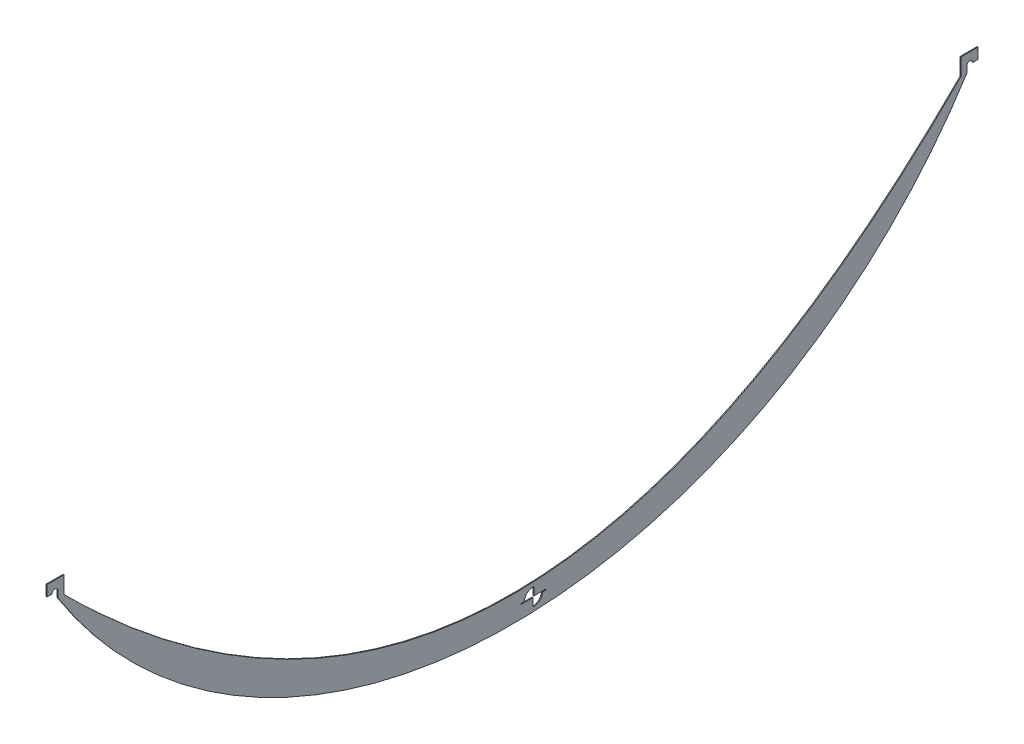
ISO-10303-21;
HEADER;
FILE_DESCRIPTION(('STEP AP214'),'2;1');
FILE_NAME('part.step','',(''),(''),'','','');
FILE_SCHEMA(('AUTOMOTIVE_DESIGN { 1 0 10303 214 1 1 1 1 }'));
ENDSEC;
DATA;
#1=APPLICATION_CONTEXT('core data for automotive mechanical design processes');
#2=APPLICATION_PROTOCOL_DEFINITION('international standard','automotive_design',2000,#1);
#3=PRODUCT_CONTEXT('',#1,'mechanical');
#4=PRODUCT('Part','Part','',(#3));
#5=PRODUCT_RELATED_PRODUCT_CATEGORY('part','',(#4));
#6=PRODUCT_DEFINITION_FORMATION('','',#4);
#7=PRODUCT_DEFINITION_CONTEXT('part definition',#1,'design');
#8=PRODUCT_DEFINITION('design','',#6,#7);
#9=PRODUCT_DEFINITION_SHAPE('','',#8);
#10=(LENGTH_UNIT() NAMED_UNIT(*) SI_UNIT(.MILLI.,.METRE.));
#11=(NAMED_UNIT(*) PLANE_ANGLE_UNIT() SI_UNIT($,.RADIAN.));
#12=(NAMED_UNIT(*) SI_UNIT($,.STERADIAN.) SOLID_ANGLE_UNIT());
#13=UNCERTAINTY_MEASURE_WITH_UNIT(LENGTH_MEASURE(1.E-05),#10,'distance_accuracy_value','');
#14=(GEOMETRIC_REPRESENTATION_CONTEXT(3) GLOBAL_UNCERTAINTY_ASSIGNED_CONTEXT((#13)) GLOBAL_UNIT_ASSIGNED_CONTEXT((#10,
#11,#12)) REPRESENTATION_CONTEXT('',''));
#15=CARTESIAN_POINT('',(0.,0.,0.));
#16=DIRECTION('',(0.,0.,1.));
#17=DIRECTION('',(1.,0.,0.));
#18=AXIS2_PLACEMENT_3D('',#15,#16,#17);
#19=CARTESIAN_POINT('',(2.54,999668.212470862,-51519.8990676631));
#20=CARTESIAN_POINT('',(2.54,-1000331.78752917,-5.61868773729657E-07));
#21=CARTESIAN_POINT('',(2.54,999668.212470804,51519.8990687846));
#22=B_SPLINE_CURVE_WITH_KNOTS('',2,(#19,#20,#21),.UNSPECIFIED.,.F.,.F.,(3,3),(0.,1.),.UNSPECIFIED.);
#23=DIRECTION('',(-1.,0.,0.));
#24=VECTOR('',#23,1.);
#25=SURFACE_OF_LINEAR_EXTRUSION('',#22,#24);
#26=CARTESIAN_POINT('',(0.,999668.212470862,-51519.8990676631));
#27=CARTESIAN_POINT('',(0.,-1000331.78752917,-5.61868773729657E-07));
#28=CARTESIAN_POINT('',(0.,999668.212470804,51519.8990687846));
#29=B_SPLINE_CURVE_WITH_KNOTS('',2,(#26,#27,#28),.UNSPECIFIED.,.F.,.F.,(3,3),(0.,1.),.UNSPECIFIED.);
#30=CARTESIAN_POINT('',(0.,331.787470833103,-1327.15));
#31=VERTEX_POINT('',#30);
#32=CARTESIAN_POINT('',(0.,331.787470833103,1327.15));
#33=VERTEX_POINT('',#32);
#34=EDGE_CURVE('E283',#31,#33,#29,.T.);
#35=ORIENTED_EDGE('',*,*,#34,.T.);
#36=DIRECTION('',(-1.,0.,0.));
#37=VECTOR('',#36,1.);
#38=CARTESIAN_POINT('',(2.54,331.787470833103,1327.15));
#39=LINE('',#38,#37);
#40=CARTESIAN_POINT('',(2.54,331.787470833103,1327.15));
#41=VERTEX_POINT('',#40);
#42=EDGE_CURVE('E11',#41,#33,#39,.T.);
#43=ORIENTED_EDGE('',*,*,#42,.F.);
#44=CARTESIAN_POINT('',(2.54,331.787470833103,-1327.15));
#45=VERTEX_POINT('',#44);
#46=EDGE_CURVE('E302',#45,#41,#22,.T.);
#47=ORIENTED_EDGE('',*,*,#46,.F.);
#48=DIRECTION('',(-1.,0.,0.));
#49=VECTOR('',#48,1.);
#50=CARTESIAN_POINT('',(2.54,331.787470833103,-1327.15));
#51=LINE('',#50,#49);
#52=EDGE_CURVE('E338',#45,#31,#51,.T.);
#53=ORIENTED_EDGE('',*,*,#52,.T.);
#54=EDGE_LOOP('',(#35,#43,#47,#53));
#55=FACE_BOUND('',#54,.T.);
#56=ADVANCED_FACE('F33',(#55),#25,.F.);
#57=CARTESIAN_POINT('',(2.54,331.787470833103,1327.15));
#58=DIRECTION('',(0.,-8.47967620314441E-12,1.));
#59=DIRECTION('',(0.,-1.,-8.47967620314441E-12));
#60=AXIS2_PLACEMENT_3D('',#57,#58,#59);
#61=PLANE('',#60);
#62=DIRECTION('',(0.,1.,8.47967620314441E-12));
#63=VECTOR('',#62,1.);
#64=CARTESIAN_POINT('',(0.,331.787470833103,1327.15));
#65=LINE('',#64,#63);
#66=CARTESIAN_POINT('',(0.,382.587350832628,1327.15000000043));
#67=VERTEX_POINT('',#66);
#68=EDGE_CURVE('E343',#33,#67,#65,.T.);
#69=ORIENTED_EDGE('',*,*,#68,.T.);
#70=DIRECTION('',(-1.,0.,0.));
#71=VECTOR('',#70,1.);
#72=CARTESIAN_POINT('',(2.54,382.587350832628,1327.15000000043));
#73=LINE('',#72,#71);
#74=CARTESIAN_POINT('',(2.54,382.587350832628,1327.15000000043));
#75=VERTEX_POINT('',#74);
#76=EDGE_CURVE('E41',#75,#67,#73,.T.);
#77=ORIENTED_EDGE('',*,*,#76,.F.);
#78=DIRECTION('',(0.,1.,8.47967620314441E-12));
#79=VECTOR('',#78,1.);
#80=CARTESIAN_POINT('',(2.54,331.787470833103,1327.15));
#81=LINE('',#80,#79);
#82=EDGE_CURVE('E308',#41,#75,#81,.T.);
#83=ORIENTED_EDGE('',*,*,#82,.F.);
#84=ORIENTED_EDGE('',*,*,#42,.T.);
#85=EDGE_LOOP('',(#69,#77,#83,#84));
#86=FACE_BOUND('',#85,.T.);
#87=ADVANCED_FACE('F431',(#86),#61,.F.);
#88=CARTESIAN_POINT('',(2.54,382.587350832628,1327.15000000043));
#89=DIRECTION('',(0.,-1.,0.));
#90=DIRECTION('',(0.,0.,-1.));
#91=AXIS2_PLACEMENT_3D('',#88,#89,#90);
#92=PLANE('',#91);
#93=DIRECTION('',(0.,0.,1.));
#94=VECTOR('',#93,1.);
#95=CARTESIAN_POINT('',(0.,382.587350832628,1327.15000000043));
#96=LINE('',#95,#94);
#97=CARTESIAN_POINT('',(0.,382.587350832623,1377.95000240559));
#98=VERTEX_POINT('',#97);
#99=EDGE_CURVE('E348',#67,#98,#96,.T.);
#100=ORIENTED_EDGE('',*,*,#99,.T.);
#101=DIRECTION('',(-1.,0.,0.));
#102=VECTOR('',#101,1.);
#103=CARTESIAN_POINT('',(2.54,382.587350832623,1377.95000240559));
#104=LINE('',#103,#102);
#105=CARTESIAN_POINT('',(2.54,382.587350832623,1377.95000240559));
#106=VERTEX_POINT('',#105);
#107=EDGE_CURVE('E403',#106,#98,#104,.T.);
#108=ORIENTED_EDGE('',*,*,#107,.F.);
#109=DIRECTION('',(0.,0.,1.));
#110=VECTOR('',#109,1.);
#111=CARTESIAN_POINT('',(2.54,382.587350832628,1327.15000000043));
#112=LINE('',#111,#110);
#113=EDGE_CURVE('E314',#75,#106,#112,.T.);
#114=ORIENTED_EDGE('',*,*,#113,.F.);
#115=ORIENTED_EDGE('',*,*,#76,.T.);
#116=EDGE_LOOP('',(#100,#108,#114,#115));
#117=FACE_BOUND('',#116,.T.);
#118=ADVANCED_FACE('F410',(#117),#92,.F.);
#119=CARTESIAN_POINT('',(2.54,382.587350832623,1377.95000240559));
#120=DIRECTION('',(0.,0.,-1.));
#121=DIRECTION('',(0.,1.,0.));
#122=AXIS2_PLACEMENT_3D('',#119,#120,#121);
#123=PLANE('',#122);
#124=DIRECTION('',(0.,-1.,0.));
#125=VECTOR('',#124,1.);
#126=CARTESIAN_POINT('',(0.,382.587350832623,1377.95000240559));
#127=LINE('',#126,#125);
#128=CARTESIAN_POINT('',(0.,350.761150832623,1377.95000240559));
#129=VERTEX_POINT('',#128);
#130=EDGE_CURVE('E350',#98,#129,#127,.T.);
#131=ORIENTED_EDGE('',*,*,#130,.T.);
#132=DIRECTION('',(-1.,0.,0.));
#133=VECTOR('',#132,1.);
#134=CARTESIAN_POINT('',(2.54,350.761150832623,1377.95000240559));
#135=LINE('',#134,#133);
#136=CARTESIAN_POINT('',(2.54,350.761150832623,1377.95000240559));
#137=VERTEX_POINT('',#136);
#138=EDGE_CURVE('E400',#137,#129,#135,.T.);
#139=ORIENTED_EDGE('',*,*,#138,.F.);
#140=DIRECTION('',(0.,-1.,0.));
#141=VECTOR('',#140,1.);
#142=CARTESIAN_POINT('',(2.54,382.587350832623,1377.95000240559));
#143=LINE('',#142,#141);
#144=EDGE_CURVE('E316',#106,#137,#143,.T.);
#145=ORIENTED_EDGE('',*,*,#144,.F.);
#146=ORIENTED_EDGE('',*,*,#107,.T.);
#147=EDGE_LOOP('',(#131,#139,#145,#146));
#148=FACE_BOUND('',#147,.T.);
#149=ADVANCED_FACE('F419',(#148),#123,.F.);
#150=CARTESIAN_POINT('',(2.54,350.761150832623,1377.95000240559));
#151=DIRECTION('',(0.,1.,0.));
#152=DIRECTION('',(0.,0.,1.));
#153=AXIS2_PLACEMENT_3D('',#150,#151,#152);
#154=PLANE('',#153);
#155=DIRECTION('',(0.,0.,-1.));
#156=VECTOR('',#155,1.);
#157=CARTESIAN_POINT('',(0.,350.761150832623,1377.95000240559));
#158=LINE('',#157,#156);
#159=CARTESIAN_POINT('',(0.,350.761150832624,1363.01479812907));
#160=VERTEX_POINT('',#159);
#161=EDGE_CURVE('E352',#129,#160,#158,.T.);
#162=ORIENTED_EDGE('',*,*,#161,.T.);
#163=DIRECTION('',(-1.,0.,0.));
#164=VECTOR('',#163,1.);
#165=CARTESIAN_POINT('',(2.54,350.761150832624,1363.01479812907));
#166=LINE('',#165,#164);
#167=CARTESIAN_POINT('',(2.54,350.761150832624,1363.01479812907));
#168=VERTEX_POINT('',#167);
#169=EDGE_CURVE('E397',#168,#160,#166,.T.);
#170=ORIENTED_EDGE('',*,*,#169,.F.);
#171=DIRECTION('',(0.,0.,-1.));
#172=VECTOR('',#171,1.);
#173=CARTESIAN_POINT('',(2.54,350.761150832623,1377.95000240559));
#174=LINE('',#173,#172);
#175=EDGE_CURVE('E318',#137,#168,#174,.T.);
#176=ORIENTED_EDGE('',*,*,#175,.F.);
#177=ORIENTED_EDGE('',*,*,#138,.T.);
#178=EDGE_LOOP('',(#162,#170,#176,#177));
#179=FACE_BOUND('',#178,.T.);
#180=ADVANCED_FACE('F423',(#179),#154,.F.);
#181=CARTESIAN_POINT('',(2.54,350.761150832626,1354.04859906458));
#182=DIRECTION('',(-1.,0.,0.));
#183=DIRECTION('',(0.,0.,1.));
#184=AXIS2_PLACEMENT_3D('',#181,#182,#183);
#185=CYLINDRICAL_SURFACE('',#184,8.96619906449059);
#186=CARTESIAN_POINT('',(0.,350.761150832626,1354.04859906458));
#187=DIRECTION('',(-1.,0.,0.));
#188=DIRECTION('',(0.,0.,1.));
#189=AXIS2_PLACEMENT_3D('',#186,#187,#188);
#190=CIRCLE('',#189,8.96619906449059);
#191=CARTESIAN_POINT('',(0.,350.761150832626,1345.08240000009));
#192=VERTEX_POINT('',#191);
#193=EDGE_CURVE('E354',#160,#192,#190,.T.);
#194=ORIENTED_EDGE('',*,*,#193,.T.);
#195=DIRECTION('',(-1.,0.,0.));
#196=VECTOR('',#195,1.);
#197=CARTESIAN_POINT('',(2.54,350.761150832626,1345.08240000009));
#198=LINE('',#197,#196);
#199=CARTESIAN_POINT('',(2.54,350.761150832626,1345.08240000009));
#200=VERTEX_POINT('',#199);
#201=EDGE_CURVE('E394',#200,#192,#198,.T.);
#202=ORIENTED_EDGE('',*,*,#201,.F.);
#203=CARTESIAN_POINT('',(2.54,350.761150832626,1354.04859906458));
#204=DIRECTION('',(-1.,0.,0.));
#205=DIRECTION('',(0.,0.,1.));
#206=AXIS2_PLACEMENT_3D('',#203,#204,#205);
#207=CIRCLE('',#206,8.96619906449059);
#208=EDGE_CURVE('E320',#168,#200,#207,.T.);
#209=ORIENTED_EDGE('',*,*,#208,.F.);
#210=ORIENTED_EDGE('',*,*,#169,.T.);
#211=EDGE_LOOP('',(#194,#202,#209,#210));
#212=FACE_BOUND('',#211,.T.);
#213=ADVANCED_FACE('F474',(#212),#185,.F.);
#214=CARTESIAN_POINT('',(2.54,350.761150832626,1345.08240000009));
#215=DIRECTION('',(0.,0.,-1.));
#216=DIRECTION('',(0.,1.,0.));
#217=AXIS2_PLACEMENT_3D('',#214,#215,#216);
#218=PLANE('',#217);
#219=DIRECTION('',(0.,-1.,0.));
#220=VECTOR('',#219,1.);
#221=CARTESIAN_POINT('',(0.,350.761150832626,1345.08240000009));
#222=LINE('',#221,#220);
#223=CARTESIAN_POINT('',(0.,331.787470831942,1345.08240000019));
#224=VERTEX_POINT('',#223);
#225=EDGE_CURVE('E356',#192,#224,#222,.T.);
#226=ORIENTED_EDGE('',*,*,#225,.T.);
#227=DIRECTION('',(-1.,0.,0.));
#228=VECTOR('',#227,1.);
#229=CARTESIAN_POINT('',(2.54,331.787470831942,1345.08240000019));
#230=LINE('',#229,#228);
#231=CARTESIAN_POINT('',(2.54,331.787470831942,1345.08240000019));
#232=VERTEX_POINT('',#231);
#233=EDGE_CURVE('E391',#232,#224,#230,.T.);
#234=ORIENTED_EDGE('',*,*,#233,.F.);
#235=DIRECTION('',(0.,-1.,0.));
#236=VECTOR('',#235,1.);
#237=CARTESIAN_POINT('',(2.54,350.761150832626,1345.08240000009));
#238=LINE('',#237,#236);
#239=EDGE_CURVE('E322',#200,#232,#238,.T.);
#240=ORIENTED_EDGE('',*,*,#239,.F.);
#241=ORIENTED_EDGE('',*,*,#201,.T.);
#242=EDGE_LOOP('',(#226,#234,#240,#241));
#243=FACE_BOUND('',#242,.T.);
#244=ADVANCED_FACE('F472',(#243),#218,.F.);
#245=CARTESIAN_POINT('',(2.54,1184.80616217627,5.1695026170626E-10));
#246=DIRECTION('',(-1.,0.,0.));
#247=DIRECTION('',(0.,0.,1.));
#248=AXIS2_PLACEMENT_3D('',#245,#246,#247);
#249=CYLINDRICAL_SURFACE('',#248,1592.7609835037);
#250=CARTESIAN_POINT('',(0.,1184.80616217627,5.1695026170626E-10));
#251=DIRECTION('',(1.,0.,0.));
#252=DIRECTION('',(0.,0.,1.));
#253=AXIS2_PLACEMENT_3D('',#250,#251,#252);
#254=CIRCLE('',#253,1592.7609835037);
#255=CARTESIAN_POINT('',(0.,331.787470833133,-1345.08240000004));
#256=VERTEX_POINT('',#255);
#257=EDGE_CURVE('E358',#224,#256,#254,.T.);
#258=ORIENTED_EDGE('',*,*,#257,.T.);
#259=DIRECTION('',(-1.,0.,0.));
#260=VECTOR('',#259,1.);
#261=CARTESIAN_POINT('',(2.54,331.787470833133,-1345.08240000004));
#262=LINE('',#261,#260);
#263=CARTESIAN_POINT('',(2.54,331.787470833133,-1345.08240000004));
#264=VERTEX_POINT('',#263);
#265=EDGE_CURVE('E388',#264,#256,#262,.T.);
#266=ORIENTED_EDGE('',*,*,#265,.F.);
#267=CARTESIAN_POINT('',(2.54,1184.80616217627,5.1695026170626E-10));
#268=DIRECTION('',(1.,0.,0.));
#269=DIRECTION('',(0.,0.,1.));
#270=AXIS2_PLACEMENT_3D('',#267,#268,#269);
#271=CIRCLE('',#270,1592.7609835037);
#272=EDGE_CURVE('E324',#232,#264,#271,.T.);
#273=ORIENTED_EDGE('',*,*,#272,.F.);
#274=ORIENTED_EDGE('',*,*,#233,.T.);
#275=EDGE_LOOP('',(#258,#266,#273,#274));
#276=FACE_BOUND('',#275,.T.);
#277=ADVANCED_FACE('F467',(#276),#249,.T.);
#278=CARTESIAN_POINT('',(2.54,350.761150832627,-1345.08240000004));
#279=DIRECTION('',(0.,0.,1.));
#280=DIRECTION('',(1.,0.,0.));
#281=AXIS2_PLACEMENT_3D('',#278,#279,#280);
#282=PLANE('',#281);
#283=DIRECTION('',(0.,1.,0.));
#284=VECTOR('',#283,1.);
#285=CARTESIAN_POINT('',(0.,350.761150832627,-1345.08240000004));
#286=LINE('',#285,#284);
#287=CARTESIAN_POINT('',(0.,350.761150832627,-1345.08240000004));
#288=VERTEX_POINT('',#287);
#289=EDGE_CURVE('E360',#256,#288,#286,.T.);
#290=ORIENTED_EDGE('',*,*,#289,.T.);
#291=DIRECTION('',(-1.,0.,0.));
#292=VECTOR('',#291,1.);
#293=CARTESIAN_POINT('',(2.54,350.761150832627,-1345.08240000004));
#294=LINE('',#293,#292);
#295=CARTESIAN_POINT('',(2.54,350.761150832627,-1345.08240000004));
#296=VERTEX_POINT('',#295);
#297=EDGE_CURVE('E385',#296,#288,#294,.T.);
#298=ORIENTED_EDGE('',*,*,#297,.F.);
#299=DIRECTION('',(0.,1.,0.));
#300=VECTOR('',#299,1.);
#301=CARTESIAN_POINT('',(2.54,350.761150832627,-1345.08240000004));
#302=LINE('',#301,#300);
#303=EDGE_CURVE('E326',#264,#296,#302,.T.);
#304=ORIENTED_EDGE('',*,*,#303,.F.);
#305=ORIENTED_EDGE('',*,*,#265,.T.);
#306=EDGE_LOOP('',(#290,#298,#304,#305));
#307=FACE_BOUND('',#306,.T.);
#308=ADVANCED_FACE('F462',(#307),#282,.F.);
#309=CARTESIAN_POINT('',(2.54,350.761150832627,-1354.04859906454));
#310=DIRECTION('',(-1.,0.,0.));
#311=DIRECTION('',(0.,0.,1.));
#312=AXIS2_PLACEMENT_3D('',#309,#310,#311);
#313=CYLINDRICAL_SURFACE('',#312,8.96619906449081);
#314=CARTESIAN_POINT('',(0.,350.761150832627,-1354.04859906454));
#315=DIRECTION('',(-1.,0.,0.));
#316=DIRECTION('',(0.,0.,-1.));
#317=AXIS2_PLACEMENT_3D('',#314,#315,#316);
#318=CIRCLE('',#317,8.96619906449081);
#319=CARTESIAN_POINT('',(0.,350.761150832627,-1363.01479812903));
#320=VERTEX_POINT('',#319);
#321=EDGE_CURVE('E362',#288,#320,#318,.T.);
#322=ORIENTED_EDGE('',*,*,#321,.T.);
#323=DIRECTION('',(-1.,0.,0.));
#324=VECTOR('',#323,1.);
#325=CARTESIAN_POINT('',(2.54,350.761150832627,-1363.01479812903));
#326=LINE('',#325,#324);
#327=CARTESIAN_POINT('',(2.54,350.761150832627,-1363.01479812903));
#328=VERTEX_POINT('',#327);
#329=EDGE_CURVE('E382',#328,#320,#326,.T.);
#330=ORIENTED_EDGE('',*,*,#329,.F.);
#331=CARTESIAN_POINT('',(2.54,350.761150832627,-1354.04859906454));
#332=DIRECTION('',(-1.,0.,0.));
#333=DIRECTION('',(0.,0.,-1.));
#334=AXIS2_PLACEMENT_3D('',#331,#332,#333);
#335=CIRCLE('',#334,8.96619906449081);
#336=EDGE_CURVE('E328',#296,#328,#335,.T.);
#337=ORIENTED_EDGE('',*,*,#336,.F.);
#338=ORIENTED_EDGE('',*,*,#297,.T.);
#339=EDGE_LOOP('',(#322,#330,#337,#338));
#340=FACE_BOUND('',#339,.T.);
#341=ADVANCED_FACE('F458',(#340),#313,.F.);
#342=CARTESIAN_POINT('',(2.54,350.761150832627,-1377.95000240555));
#343=DIRECTION('',(0.,1.,0.));
#344=DIRECTION('',(0.,0.,1.));
#345=AXIS2_PLACEMENT_3D('',#342,#343,#344);
#346=PLANE('',#345);
#347=DIRECTION('',(0.,0.,-1.));
#348=VECTOR('',#347,1.);
#349=CARTESIAN_POINT('',(0.,350.761150832627,-1377.95000240555));
#350=LINE('',#349,#348);
#351=CARTESIAN_POINT('',(0.,350.761150832627,-1377.95000240555));
#352=VERTEX_POINT('',#351);
#353=EDGE_CURVE('E364',#320,#352,#350,.T.);
#354=ORIENTED_EDGE('',*,*,#353,.T.);
#355=DIRECTION('',(-1.,0.,0.));
#356=VECTOR('',#355,1.);
#357=CARTESIAN_POINT('',(2.54,350.761150832627,-1377.95000240555));
#358=LINE('',#357,#356);
#359=CARTESIAN_POINT('',(2.54,350.761150832627,-1377.95000240555));
#360=VERTEX_POINT('',#359);
#361=EDGE_CURVE('E379',#360,#352,#358,.T.);
#362=ORIENTED_EDGE('',*,*,#361,.F.);
#363=DIRECTION('',(0.,0.,-1.));
#364=VECTOR('',#363,1.);
#365=CARTESIAN_POINT('',(2.54,350.761150832627,-1377.95000240555));
#366=LINE('',#365,#364);
#367=EDGE_CURVE('E330',#328,#360,#366,.T.);
#368=ORIENTED_EDGE('',*,*,#367,.F.);
#369=ORIENTED_EDGE('',*,*,#329,.T.);
#370=EDGE_LOOP('',(#354,#362,#368,#369));
#371=FACE_BOUND('',#370,.T.);
#372=ADVANCED_FACE('F453',(#371),#346,.F.);
#373=CARTESIAN_POINT('',(2.54,382.587350832626,-1377.95000240555));
#374=DIRECTION('',(0.,0.,1.));
#375=DIRECTION('',(1.,0.,0.));
#376=AXIS2_PLACEMENT_3D('',#373,#374,#375);
#377=PLANE('',#376);
#378=DIRECTION('',(0.,1.,0.));
#379=VECTOR('',#378,1.);
#380=CARTESIAN_POINT('',(0.,382.587350832626,-1377.95000240555));
#381=LINE('',#380,#379);
#382=CARTESIAN_POINT('',(0.,382.587350832626,-1377.95000240555));
#383=VERTEX_POINT('',#382);
#384=EDGE_CURVE('E366',#352,#383,#381,.T.);
#385=ORIENTED_EDGE('',*,*,#384,.T.);
#386=DIRECTION('',(-1.,0.,0.));
#387=VECTOR('',#386,1.);
#388=CARTESIAN_POINT('',(2.54,382.587350832626,-1377.95000240555));
#389=LINE('',#388,#387);
#390=CARTESIAN_POINT('',(2.54,382.587350832626,-1377.95000240555));
#391=VERTEX_POINT('',#390);
#392=EDGE_CURVE('E376',#391,#383,#389,.T.);
#393=ORIENTED_EDGE('',*,*,#392,.F.);
#394=DIRECTION('',(0.,1.,0.));
#395=VECTOR('',#394,1.);
#396=CARTESIAN_POINT('',(2.54,382.587350832626,-1377.95000240555));
#397=LINE('',#396,#395);
#398=EDGE_CURVE('E332',#360,#391,#397,.T.);
#399=ORIENTED_EDGE('',*,*,#398,.F.);
#400=ORIENTED_EDGE('',*,*,#361,.T.);
#401=EDGE_LOOP('',(#385,#393,#399,#400));
#402=FACE_BOUND('',#401,.T.);
#403=ADVANCED_FACE('F447',(#402),#377,.F.);
#404=CARTESIAN_POINT('',(2.54,382.587350832626,-1327.14999999998));
#405=DIRECTION('',(0.,-1.,0.));
#406=DIRECTION('',(0.,0.,-1.));
#407=AXIS2_PLACEMENT_3D('',#404,#405,#406);
#408=PLANE('',#407);
#409=DIRECTION('',(0.,0.,1.));
#410=VECTOR('',#409,1.);
#411=CARTESIAN_POINT('',(0.,382.587350832626,-1327.14999999998));
#412=LINE('',#411,#410);
#413=CARTESIAN_POINT('',(0.,382.587350832626,-1327.14999999998));
#414=VERTEX_POINT('',#413);
#415=EDGE_CURVE('E368',#383,#414,#412,.T.);
#416=ORIENTED_EDGE('',*,*,#415,.T.);
#417=DIRECTION('',(-1.,0.,0.));
#418=VECTOR('',#417,1.);
#419=CARTESIAN_POINT('',(2.54,382.587350832626,-1327.14999999998));
#420=LINE('',#419,#418);
#421=CARTESIAN_POINT('',(2.54,382.587350832626,-1327.14999999998));
#422=VERTEX_POINT('',#421);
#423=EDGE_CURVE('E373',#422,#414,#420,.T.);
#424=ORIENTED_EDGE('',*,*,#423,.F.);
#425=DIRECTION('',(0.,0.,1.));
#426=VECTOR('',#425,1.);
#427=CARTESIAN_POINT('',(2.54,382.587350832626,-1327.14999999998));
#428=LINE('',#427,#426);
#429=EDGE_CURVE('E334',#391,#422,#428,.T.);
#430=ORIENTED_EDGE('',*,*,#429,.F.);
#431=ORIENTED_EDGE('',*,*,#392,.T.);
#432=EDGE_LOOP('',(#416,#424,#430,#431));
#433=FACE_BOUND('',#432,.T.);
#434=ADVANCED_FACE('F443',(#433),#408,.F.);
#435=CARTESIAN_POINT('',(2.54,331.787470833103,-1327.15));
#436=DIRECTION('',(0.,4.10870908812159E-13,-1.));
#437=DIRECTION('',(0.,1.,4.10870908812159E-13));
#438=AXIS2_PLACEMENT_3D('',#435,#436,#437);
#439=PLANE('',#438);
#440=DIRECTION('',(0.,-1.,-4.10870908812159E-13));
#441=VECTOR('',#440,1.);
#442=CARTESIAN_POINT('',(0.,331.787470833103,-1327.15));
#443=LINE('',#442,#441);
#444=EDGE_CURVE('E309',#414,#31,#443,.T.);
#445=ORIENTED_EDGE('',*,*,#444,.T.);
#446=ORIENTED_EDGE('',*,*,#52,.F.);
#447=DIRECTION('',(0.,-1.,-4.10870908812159E-13));
#448=VECTOR('',#447,1.);
#449=CARTESIAN_POINT('',(2.54,331.787470833103,-1327.15));
#450=LINE('',#449,#448);
#451=EDGE_CURVE('E336',#422,#45,#450,.T.);
#452=ORIENTED_EDGE('',*,*,#451,.F.);
#453=ORIENTED_EDGE('',*,*,#423,.T.);
#454=EDGE_LOOP('',(#445,#446,#452,#453));
#455=FACE_BOUND('',#454,.T.);
#456=ADVANCED_FACE('F438',(#455),#439,.F.);
#457=CARTESIAN_POINT('',(2.54,-331.787529166974,-5.61328761250479E-10));
#458=DIRECTION('',(1.,0.,0.));
#459=DIRECTION('',(0.,0.,-1.));
#460=AXIS2_PLACEMENT_3D('',#457,#458,#459);
#461=PLANE('',#460);
#462=DIRECTION('',(0.,0.,1.));
#463=VECTOR('',#462,1.);
#464=CARTESIAN_POINT('',(2.54,-367.132479543067,-35.3401144828838));
#465=LINE('',#464,#463);
#466=CARTESIAN_POINT('',(2.54,-367.132479543067,-35.3401144828838));
#467=VERTEX_POINT('',#466);
#468=CARTESIAN_POINT('',(2.54,-367.132479543067,-25.1801144828838));
#469=VERTEX_POINT('',#468);
#470=EDGE_CURVE('E48',#467,#469,#465,.T.);
#471=ORIENTED_EDGE('',*,*,#470,.F.);
#472=CARTESIAN_POINT('',(2.54,-368.402459675709,-60.7083456088944));
#473=DIRECTION('',(1.,0.,0.));
#474=DIRECTION('',(0.,0.,-1.));
#475=AXIS2_PLACEMENT_3D('',#472,#473,#474);
#476=CIRCLE('',#475,25.4);
#477=CARTESIAN_POINT('',(2.54,-343.002479543067,-60.7401144828838));
#478=VERTEX_POINT('',#477);
#479=EDGE_CURVE('E224',#478,#467,#476,.T.);
#480=ORIENTED_EDGE('',*,*,#479,.F.);
#481=DIRECTION('',(0.,0.,-1.));
#482=VECTOR('',#481,1.);
#483=CARTESIAN_POINT('',(2.54,-343.002479543067,-60.7401144828838));
#484=LINE('',#483,#482);
#485=CARTESIAN_POINT('',(2.54,-343.002479543067,-63.2801144828838));
#486=VERTEX_POINT('',#485);
#487=EDGE_CURVE('E227',#478,#486,#484,.T.);
#488=ORIENTED_EDGE('',*,*,#487,.T.);
#489=DIRECTION('',(0.,-1.,0.));
#490=VECTOR('',#489,1.);
#491=CARTESIAN_POINT('',(2.54,-343.002479543067,-63.2801144828838));
#492=LINE('',#491,#490);
#493=CARTESIAN_POINT('',(2.54,-367.132479543067,-63.2801144828838));
#494=VERTEX_POINT('',#493);
#495=EDGE_CURVE('E276',#486,#494,#492,.T.);
#496=ORIENTED_EDGE('',*,*,#495,.T.);
#497=DIRECTION('',(0.,0.,1.));
#498=VECTOR('',#497,1.);
#499=CARTESIAN_POINT('',(2.54,-367.132479543067,-98.8401144828838));
#500=LINE('',#499,#498);
#501=CARTESIAN_POINT('',(2.54,-367.132479543067,-98.8401144828838));
#502=VERTEX_POINT('',#501);
#503=EDGE_CURVE('E273',#502,#494,#500,.T.);
#504=ORIENTED_EDGE('',*,*,#503,.F.);
#505=DIRECTION('',(0.,1.,0.));
#506=VECTOR('',#505,1.);
#507=CARTESIAN_POINT('',(2.54,-369.672479543067,-98.8401144828838));
#508=LINE('',#507,#506);
#509=CARTESIAN_POINT('',(2.54,-369.672479543067,-98.8401144828838));
#510=VERTEX_POINT('',#509);
#511=EDGE_CURVE('E270',#510,#502,#508,.T.);
#512=ORIENTED_EDGE('',*,*,#511,.F.);
#513=DIRECTION('',(0.,0.,-1.));
#514=VECTOR('',#513,1.);
#515=CARTESIAN_POINT('',(2.54,-369.672479543067,-88.6801144828838));
#516=LINE('',#515,#514);
#517=CARTESIAN_POINT('',(2.54,-369.672479543067,-88.6801144828839));
#518=VERTEX_POINT('',#517);
#519=EDGE_CURVE('E267',#518,#510,#516,.T.);
#520=ORIENTED_EDGE('',*,*,#519,.F.);
#521=CARTESIAN_POINT('',(2.54,-368.402499410424,-63.3118833568732));
#522=DIRECTION('',(1.,0.,0.));
#523=DIRECTION('',(0.,0.,-1.));
#524=AXIS2_PLACEMENT_3D('',#521,#522,#523);
#525=CIRCLE('',#524,25.4);
#526=CARTESIAN_POINT('',(2.54,-393.802479543067,-63.2801144828838));
#527=VERTEX_POINT('',#526);
#528=EDGE_CURVE('E264',#527,#518,#525,.T.);
#529=ORIENTED_EDGE('',*,*,#528,.F.);
#530=DIRECTION('',(0.,0.,1.));
#531=VECTOR('',#530,1.);
#532=CARTESIAN_POINT('',(2.54,-393.802479543067,-63.2801144828838));
#533=LINE('',#532,#531);
#534=CARTESIAN_POINT('',(2.54,-393.802479543067,-60.7401144828838));
#535=VERTEX_POINT('',#534);
#536=EDGE_CURVE('E261',#527,#535,#533,.T.);
#537=ORIENTED_EDGE('',*,*,#536,.T.);
#538=DIRECTION('',(0.,1.,0.));
#539=VECTOR('',#538,1.);
#540=CARTESIAN_POINT('',(2.54,-393.802479543067,-60.7401144828838));
#541=LINE('',#540,#539);
#542=CARTESIAN_POINT('',(2.54,-369.672479543067,-60.7401144828838));
#543=VERTEX_POINT('',#542);
#544=EDGE_CURVE('E258',#535,#543,#541,.T.);
#545=ORIENTED_EDGE('',*,*,#544,.T.);
#546=DIRECTION('',(0.,0.,1.));
#547=VECTOR('',#546,1.);
#548=CARTESIAN_POINT('',(2.54,-369.672479543067,-60.7401144828838));
#549=LINE('',#548,#547);
#550=CARTESIAN_POINT('',(2.54,-369.672479543067,-25.1801144828838));
#551=VERTEX_POINT('',#550);
#552=EDGE_CURVE('E255',#543,#551,#549,.T.);
#553=ORIENTED_EDGE('',*,*,#552,.T.);
#554=DIRECTION('',(0.,-1.,0.));
#555=VECTOR('',#554,1.);
#556=CARTESIAN_POINT('',(2.54,-367.132479543067,-25.1801144828838));
#557=LINE('',#556,#555);
#558=EDGE_CURVE('E253',#469,#551,#557,.T.);
#559=ORIENTED_EDGE('',*,*,#558,.F.);
#560=EDGE_LOOP('',(#471,#480,#488,#496,#504,#512,#520,#529,#537,#545,#553,#559));
#561=FACE_BOUND('',#560,.T.);
#562=ORIENTED_EDGE('',*,*,#46,.T.);
#563=ORIENTED_EDGE('',*,*,#82,.T.);
#564=ORIENTED_EDGE('',*,*,#113,.T.);
#565=ORIENTED_EDGE('',*,*,#144,.T.);
#566=ORIENTED_EDGE('',*,*,#175,.T.);
#567=ORIENTED_EDGE('',*,*,#208,.T.);
#568=ORIENTED_EDGE('',*,*,#239,.T.);
#569=ORIENTED_EDGE('',*,*,#272,.T.);
#570=ORIENTED_EDGE('',*,*,#303,.T.);
#571=ORIENTED_EDGE('',*,*,#336,.T.);
#572=ORIENTED_EDGE('',*,*,#367,.T.);
#573=ORIENTED_EDGE('',*,*,#398,.T.);
#574=ORIENTED_EDGE('',*,*,#429,.T.);
#575=ORIENTED_EDGE('',*,*,#451,.T.);
#576=EDGE_LOOP('',(#562,#563,#564,#565,#566,#567,#568,#569,#570,#571,#572,#573,#574,#575));
#577=FACE_BOUND('',#576,.T.);
#578=ADVANCED_FACE('F427',(#561,#577),#461,.T.);
#579=CARTESIAN_POINT('',(0.,-331.787529166974,-5.61328761250479E-10));
#580=DIRECTION('',(1.,0.,0.));
#581=DIRECTION('',(0.,0.,-1.));
#582=AXIS2_PLACEMENT_3D('',#579,#580,#581);
#583=PLANE('',#582);
#584=CARTESIAN_POINT('',(0.,-368.402459675709,-60.7083456088944));
#585=DIRECTION('',(1.,0.,0.));
#586=DIRECTION('',(0.,0.,-1.));
#587=AXIS2_PLACEMENT_3D('',#584,#585,#586);
#588=CIRCLE('',#587,25.4);
#589=CARTESIAN_POINT('',(0.,-343.002479543067,-60.7401144828838));
#590=VERTEX_POINT('',#589);
#591=CARTESIAN_POINT('',(0.,-367.132479543067,-35.3401144828838));
#592=VERTEX_POINT('',#591);
#593=EDGE_CURVE('E211',#590,#592,#588,.T.);
#594=ORIENTED_EDGE('',*,*,#593,.T.);
#595=DIRECTION('',(0.,0.,1.));
#596=VECTOR('',#595,1.);
#597=CARTESIAN_POINT('',(0.,-367.132479543067,-35.3401144828838));
#598=LINE('',#597,#596);
#599=CARTESIAN_POINT('',(0.,-367.132479543067,-25.1801144828838));
#600=VERTEX_POINT('',#599);
#601=EDGE_CURVE('E208',#592,#600,#598,.T.);
#602=ORIENTED_EDGE('',*,*,#601,.T.);
#603=DIRECTION('',(0.,-1.,0.));
#604=VECTOR('',#603,1.);
#605=CARTESIAN_POINT('',(0.,-367.132479543067,-25.1801144828838));
#606=LINE('',#605,#604);
#607=CARTESIAN_POINT('',(0.,-369.672479543067,-25.1801144828838));
#608=VERTEX_POINT('',#607);
#609=EDGE_CURVE('E214',#600,#608,#606,.T.);
#610=ORIENTED_EDGE('',*,*,#609,.T.);
#611=DIRECTION('',(0.,0.,1.));
#612=VECTOR('',#611,1.);
#613=CARTESIAN_POINT('',(0.,-369.672479543067,-60.7401144828838));
#614=LINE('',#613,#612);
#615=CARTESIAN_POINT('',(0.,-369.672479543067,-60.7401144828838));
#616=VERTEX_POINT('',#615);
#617=EDGE_CURVE('E218',#616,#608,#614,.T.);
#618=ORIENTED_EDGE('',*,*,#617,.F.);
#619=DIRECTION('',(0.,1.,0.));
#620=VECTOR('',#619,1.);
#621=CARTESIAN_POINT('',(0.,-393.802479543067,-60.7401144828838));
#622=LINE('',#621,#620);
#623=CARTESIAN_POINT('',(0.,-393.802479543067,-60.7401144828838));
#624=VERTEX_POINT('',#623);
#625=EDGE_CURVE('E231',#624,#616,#622,.T.);
#626=ORIENTED_EDGE('',*,*,#625,.F.);
#627=DIRECTION('',(0.,0.,1.));
#628=VECTOR('',#627,1.);
#629=CARTESIAN_POINT('',(0.,-393.802479543067,-63.2801144828838));
#630=LINE('',#629,#628);
#631=CARTESIAN_POINT('',(0.,-393.802479543067,-63.2801144828838));
#632=VERTEX_POINT('',#631);
#633=EDGE_CURVE('E233',#632,#624,#630,.T.);
#634=ORIENTED_EDGE('',*,*,#633,.F.);
#635=CARTESIAN_POINT('',(0.,-368.402499410424,-63.3118833568732));
#636=DIRECTION('',(1.,0.,0.));
#637=DIRECTION('',(0.,0.,-1.));
#638=AXIS2_PLACEMENT_3D('',#635,#636,#637);
#639=CIRCLE('',#638,25.4);
#640=CARTESIAN_POINT('',(0.,-369.672479543067,-88.6801144828839));
#641=VERTEX_POINT('',#640);
#642=EDGE_CURVE('E235',#632,#641,#639,.T.);
#643=ORIENTED_EDGE('',*,*,#642,.T.);
#644=DIRECTION('',(0.,0.,-1.));
#645=VECTOR('',#644,1.);
#646=CARTESIAN_POINT('',(0.,-369.672479543067,-88.6801144828838));
#647=LINE('',#646,#645);
#648=CARTESIAN_POINT('',(0.,-369.672479543067,-98.8401144828838));
#649=VERTEX_POINT('',#648);
#650=EDGE_CURVE('E238',#641,#649,#647,.T.);
#651=ORIENTED_EDGE('',*,*,#650,.T.);
#652=DIRECTION('',(0.,1.,0.));
#653=VECTOR('',#652,1.);
#654=CARTESIAN_POINT('',(0.,-369.672479543067,-98.8401144828838));
#655=LINE('',#654,#653);
#656=CARTESIAN_POINT('',(0.,-367.132479543067,-98.8401144828838));
#657=VERTEX_POINT('',#656);
#658=EDGE_CURVE('E241',#649,#657,#655,.T.);
#659=ORIENTED_EDGE('',*,*,#658,.T.);
#660=DIRECTION('',(0.,0.,1.));
#661=VECTOR('',#660,1.);
#662=CARTESIAN_POINT('',(0.,-367.132479543067,-98.8401144828838));
#663=LINE('',#662,#661);
#664=CARTESIAN_POINT('',(0.,-367.132479543067,-63.2801144828838));
#665=VERTEX_POINT('',#664);
#666=EDGE_CURVE('E244',#657,#665,#663,.T.);
#667=ORIENTED_EDGE('',*,*,#666,.T.);
#668=DIRECTION('',(0.,-1.,0.));
#669=VECTOR('',#668,1.);
#670=CARTESIAN_POINT('',(0.,-343.002479543067,-63.2801144828838));
#671=LINE('',#670,#669);
#672=CARTESIAN_POINT('',(0.,-343.002479543067,-63.2801144828838));
#673=VERTEX_POINT('',#672);
#674=EDGE_CURVE('E247',#673,#665,#671,.T.);
#675=ORIENTED_EDGE('',*,*,#674,.F.);
#676=DIRECTION('',(0.,0.,-1.));
#677=VECTOR('',#676,1.);
#678=CARTESIAN_POINT('',(0.,-343.002479543067,-60.7401144828838));
#679=LINE('',#678,#677);
#680=EDGE_CURVE('E249',#590,#673,#679,.T.);
#681=ORIENTED_EDGE('',*,*,#680,.F.);
#682=EDGE_LOOP('',(#594,#602,#610,#618,#626,#634,#643,#651,#659,#667,#675,#681));
#683=FACE_BOUND('',#682,.T.);
#684=ORIENTED_EDGE('',*,*,#34,.F.);
#685=ORIENTED_EDGE('',*,*,#444,.F.);
#686=ORIENTED_EDGE('',*,*,#415,.F.);
#687=ORIENTED_EDGE('',*,*,#384,.F.);
#688=ORIENTED_EDGE('',*,*,#353,.F.);
#689=ORIENTED_EDGE('',*,*,#321,.F.);
#690=ORIENTED_EDGE('',*,*,#289,.F.);
#691=ORIENTED_EDGE('',*,*,#257,.F.);
#692=ORIENTED_EDGE('',*,*,#225,.F.);
#693=ORIENTED_EDGE('',*,*,#193,.F.);
#694=ORIENTED_EDGE('',*,*,#161,.F.);
#695=ORIENTED_EDGE('',*,*,#130,.F.);
#696=ORIENTED_EDGE('',*,*,#99,.F.);
#697=ORIENTED_EDGE('',*,*,#68,.F.);
#698=EDGE_LOOP('',(#684,#685,#686,#687,#688,#689,#690,#691,#692,#693,#694,#695,#696,#697));
#699=FACE_BOUND('',#698,.T.);
#700=ADVANCED_FACE('F220',(#683,#699),#583,.F.);
#701=CARTESIAN_POINT('',(0.,-367.132479543067,-35.3401144828838));
#702=DIRECTION('',(0.,1.,0.));
#703=DIRECTION('',(0.,0.,1.));
#704=AXIS2_PLACEMENT_3D('',#701,#702,#703);
#705=PLANE('',#704);
#706=ORIENTED_EDGE('',*,*,#470,.T.);
#707=DIRECTION('',(1.,0.,0.));
#708=VECTOR('',#707,1.);
#709=CARTESIAN_POINT('',(0.,-367.132479543067,-25.1801144828838));
#710=LINE('',#709,#708);
#711=EDGE_CURVE('E205',#600,#469,#710,.T.);
#712=ORIENTED_EDGE('',*,*,#711,.F.);
#713=ORIENTED_EDGE('',*,*,#601,.F.);
#714=DIRECTION('',(1.,0.,0.));
#715=VECTOR('',#714,1.);
#716=CARTESIAN_POINT('',(0.,-367.132479543067,-35.3401144828838));
#717=LINE('',#716,#715);
#718=EDGE_CURVE('E281',#592,#467,#717,.T.);
#719=ORIENTED_EDGE('',*,*,#718,.T.);
#720=EDGE_LOOP('',(#706,#712,#713,#719));
#721=FACE_BOUND('',#720,.T.);
#722=ADVANCED_FACE('F206',(#721),#705,.F.);
#723=CARTESIAN_POINT('',(0.,-368.402459675709,-60.7083456088944));
#724=DIRECTION('',(1.,0.,0.));
#725=DIRECTION('',(0.,0.,-1.));
#726=AXIS2_PLACEMENT_3D('',#723,#724,#725);
#727=CYLINDRICAL_SURFACE('',#726,25.4);
#728=ORIENTED_EDGE('',*,*,#479,.T.);
#729=ORIENTED_EDGE('',*,*,#718,.F.);
#730=ORIENTED_EDGE('',*,*,#593,.F.);
#731=DIRECTION('',(1.,0.,0.));
#732=VECTOR('',#731,1.);
#733=CARTESIAN_POINT('',(0.,-343.002479543067,-60.7401144828838));
#734=LINE('',#733,#732);
#735=EDGE_CURVE('E284',#590,#478,#734,.T.);
#736=ORIENTED_EDGE('',*,*,#735,.T.);
#737=EDGE_LOOP('',(#728,#729,#730,#736));
#738=FACE_BOUND('',#737,.T.);
#739=ADVANCED_FACE('F593',(#738),#727,.F.);
#740=CARTESIAN_POINT('',(0.,-343.002479543067,-60.7401144828838));
#741=DIRECTION('',(0.,-1.,0.));
#742=DIRECTION('',(0.,0.,-1.));
#743=AXIS2_PLACEMENT_3D('',#740,#741,#742);
#744=PLANE('',#743);
#745=ORIENTED_EDGE('',*,*,#487,.F.);
#746=ORIENTED_EDGE('',*,*,#735,.F.);
#747=ORIENTED_EDGE('',*,*,#680,.T.);
#748=DIRECTION('',(1.,0.,0.));
#749=VECTOR('',#748,1.);
#750=CARTESIAN_POINT('',(0.,-343.002479543067,-63.2801144828838));
#751=LINE('',#750,#749);
#752=EDGE_CURVE('E286',#673,#486,#751,.T.);
#753=ORIENTED_EDGE('',*,*,#752,.T.);
#754=EDGE_LOOP('',(#745,#746,#747,#753));
#755=FACE_BOUND('',#754,.T.);
#756=ADVANCED_FACE('F602',(#755),#744,.T.);
#757=CARTESIAN_POINT('',(0.,-343.002479543067,-63.2801144828838));
#758=DIRECTION('',(0.,0.,1.));
#759=DIRECTION('',(1.,0.,0.));
#760=AXIS2_PLACEMENT_3D('',#757,#758,#759);
#761=PLANE('',#760);
#762=ORIENTED_EDGE('',*,*,#495,.F.);
#763=ORIENTED_EDGE('',*,*,#752,.F.);
#764=ORIENTED_EDGE('',*,*,#674,.T.);
#765=DIRECTION('',(1.,0.,0.));
#766=VECTOR('',#765,1.);
#767=CARTESIAN_POINT('',(0.,-367.132479543067,-63.2801144828838));
#768=LINE('',#767,#766);
#769=EDGE_CURVE('E288',#665,#494,#768,.T.);
#770=ORIENTED_EDGE('',*,*,#769,.T.);
#771=EDGE_LOOP('',(#762,#763,#764,#770));
#772=FACE_BOUND('',#771,.T.);
#773=ADVANCED_FACE('F612',(#772),#761,.T.);
#774=CARTESIAN_POINT('',(0.,-367.132479543067,-98.8401144828838));
#775=DIRECTION('',(0.,1.,0.));
#776=DIRECTION('',(0.,0.,1.));
#777=AXIS2_PLACEMENT_3D('',#774,#775,#776);
#778=PLANE('',#777);
#779=ORIENTED_EDGE('',*,*,#503,.T.);
#780=ORIENTED_EDGE('',*,*,#769,.F.);
#781=ORIENTED_EDGE('',*,*,#666,.F.);
#782=DIRECTION('',(1.,0.,0.));
#783=VECTOR('',#782,1.);
#784=CARTESIAN_POINT('',(0.,-367.132479543067,-98.8401144828838));
#785=LINE('',#784,#783);
#786=EDGE_CURVE('E290',#657,#502,#785,.T.);
#787=ORIENTED_EDGE('',*,*,#786,.T.);
#788=EDGE_LOOP('',(#779,#780,#781,#787));
#789=FACE_BOUND('',#788,.T.);
#790=ADVANCED_FACE('F622',(#789),#778,.F.);
#791=CARTESIAN_POINT('',(0.,-369.672479543067,-98.8401144828838));
#792=DIRECTION('',(0.,0.,-1.));
#793=DIRECTION('',(0.,1.,0.));
#794=AXIS2_PLACEMENT_3D('',#791,#792,#793);
#795=PLANE('',#794);
#796=ORIENTED_EDGE('',*,*,#511,.T.);
#797=ORIENTED_EDGE('',*,*,#786,.F.);
#798=ORIENTED_EDGE('',*,*,#658,.F.);
#799=DIRECTION('',(1.,0.,0.));
#800=VECTOR('',#799,1.);
#801=CARTESIAN_POINT('',(0.,-369.672479543067,-98.8401144828838));
#802=LINE('',#801,#800);
#803=EDGE_CURVE('E292',#649,#510,#802,.T.);
#804=ORIENTED_EDGE('',*,*,#803,.T.);
#805=EDGE_LOOP('',(#796,#797,#798,#804));
#806=FACE_BOUND('',#805,.T.);
#807=ADVANCED_FACE('F632',(#806),#795,.F.);
#808=CARTESIAN_POINT('',(0.,-369.672479543067,-88.6801144828838));
#809=DIRECTION('',(0.,-1.,0.));
#810=DIRECTION('',(0.,0.,-1.));
#811=AXIS2_PLACEMENT_3D('',#808,#809,#810);
#812=PLANE('',#811);
#813=ORIENTED_EDGE('',*,*,#519,.T.);
#814=ORIENTED_EDGE('',*,*,#803,.F.);
#815=ORIENTED_EDGE('',*,*,#650,.F.);
#816=DIRECTION('',(1.,0.,0.));
#817=VECTOR('',#816,1.);
#818=CARTESIAN_POINT('',(0.,-369.672479543067,-88.6801144828839));
#819=LINE('',#818,#817);
#820=EDGE_CURVE('E294',#641,#518,#819,.T.);
#821=ORIENTED_EDGE('',*,*,#820,.T.);
#822=EDGE_LOOP('',(#813,#814,#815,#821));
#823=FACE_BOUND('',#822,.T.);
#824=ADVANCED_FACE('F642',(#823),#812,.F.);
#825=CARTESIAN_POINT('',(0.,-368.402499410424,-63.3118833568732));
#826=DIRECTION('',(1.,0.,0.));
#827=DIRECTION('',(0.,0.,-1.));
#828=AXIS2_PLACEMENT_3D('',#825,#826,#827);
#829=CYLINDRICAL_SURFACE('',#828,25.4);
#830=ORIENTED_EDGE('',*,*,#528,.T.);
#831=ORIENTED_EDGE('',*,*,#820,.F.);
#832=ORIENTED_EDGE('',*,*,#642,.F.);
#833=DIRECTION('',(1.,0.,0.));
#834=VECTOR('',#833,1.);
#835=CARTESIAN_POINT('',(0.,-393.802479543067,-63.2801144828838));
#836=LINE('',#835,#834);
#837=EDGE_CURVE('E296',#632,#527,#836,.T.);
#838=ORIENTED_EDGE('',*,*,#837,.T.);
#839=EDGE_LOOP('',(#830,#831,#832,#838));
#840=FACE_BOUND('',#839,.T.);
#841=ADVANCED_FACE('F652',(#840),#829,.F.);
#842=CARTESIAN_POINT('',(0.,-393.802479543067,-63.2801144828838));
#843=DIRECTION('',(0.,1.,0.));
#844=DIRECTION('',(0.,0.,1.));
#845=AXIS2_PLACEMENT_3D('',#842,#843,#844);
#846=PLANE('',#845);
#847=ORIENTED_EDGE('',*,*,#536,.F.);
#848=ORIENTED_EDGE('',*,*,#837,.F.);
#849=ORIENTED_EDGE('',*,*,#633,.T.);
#850=DIRECTION('',(1.,0.,0.));
#851=VECTOR('',#850,1.);
#852=CARTESIAN_POINT('',(0.,-393.802479543067,-60.7401144828838));
#853=LINE('',#852,#851);
#854=EDGE_CURVE('E298',#624,#535,#853,.T.);
#855=ORIENTED_EDGE('',*,*,#854,.T.);
#856=EDGE_LOOP('',(#847,#848,#849,#855));
#857=FACE_BOUND('',#856,.T.);
#858=ADVANCED_FACE('F662',(#857),#846,.T.);
#859=CARTESIAN_POINT('',(0.,-393.802479543067,-60.7401144828838));
#860=DIRECTION('',(0.,0.,-1.));
#861=DIRECTION('',(0.,1.,0.));
#862=AXIS2_PLACEMENT_3D('',#859,#860,#861);
#863=PLANE('',#862);
#864=ORIENTED_EDGE('',*,*,#544,.F.);
#865=ORIENTED_EDGE('',*,*,#854,.F.);
#866=ORIENTED_EDGE('',*,*,#625,.T.);
#867=DIRECTION('',(1.,0.,0.));
#868=VECTOR('',#867,1.);
#869=CARTESIAN_POINT('',(0.,-369.672479543067,-60.7401144828838));
#870=LINE('',#869,#868);
#871=EDGE_CURVE('E300',#616,#543,#870,.T.);
#872=ORIENTED_EDGE('',*,*,#871,.T.);
#873=EDGE_LOOP('',(#864,#865,#866,#872));
#874=FACE_BOUND('',#873,.T.);
#875=ADVANCED_FACE('F672',(#874),#863,.T.);
#876=CARTESIAN_POINT('',(0.,-369.672479543067,-60.7401144828838));
#877=DIRECTION('',(0.,1.,0.));
#878=DIRECTION('',(0.,0.,1.));
#879=AXIS2_PLACEMENT_3D('',#876,#877,#878);
#880=PLANE('',#879);
#881=ORIENTED_EDGE('',*,*,#552,.F.);
#882=ORIENTED_EDGE('',*,*,#871,.F.);
#883=ORIENTED_EDGE('',*,*,#617,.T.);
#884=DIRECTION('',(1.,0.,0.));
#885=VECTOR('',#884,1.);
#886=CARTESIAN_POINT('',(0.,-369.672479543067,-25.1801144828838));
#887=LINE('',#886,#885);
#888=EDGE_CURVE('E56',#608,#551,#887,.T.);
#889=ORIENTED_EDGE('',*,*,#888,.T.);
#890=EDGE_LOOP('',(#881,#882,#883,#889));
#891=FACE_BOUND('',#890,.T.);
#892=ADVANCED_FACE('F682',(#891),#880,.T.);
#893=CARTESIAN_POINT('',(0.,-367.132479543067,-25.1801144828838));
#894=DIRECTION('',(0.,0.,1.));
#895=DIRECTION('',(1.,0.,0.));
#896=AXIS2_PLACEMENT_3D('',#893,#894,#895);
#897=PLANE('',#896);
#898=ORIENTED_EDGE('',*,*,#558,.T.);
#899=ORIENTED_EDGE('',*,*,#888,.F.);
#900=ORIENTED_EDGE('',*,*,#609,.F.);
#901=ORIENTED_EDGE('',*,*,#711,.T.);
#902=EDGE_LOOP('',(#898,#899,#900,#901));
#903=FACE_BOUND('',#902,.T.);
#904=ADVANCED_FACE('F215',(#903),#897,.F.);
#905=CLOSED_SHELL('',(#56,#87,#118,#149,#180,#213,#244,#277,#308,#341,#372,#403,#434,#456,#578,
#700,#722,#739,#756,#773,#790,#807,#824,#841,#858,#875,#892,#904));
#906=MANIFOLD_SOLID_BREP('B2',#905);
#907=ADVANCED_BREP_SHAPE_REPRESENTATION('',(#18,#906),#14);
#908=SHAPE_DEFINITION_REPRESENTATION(#9,#907);
ENDSEC;
END-ISO-10303-21;
